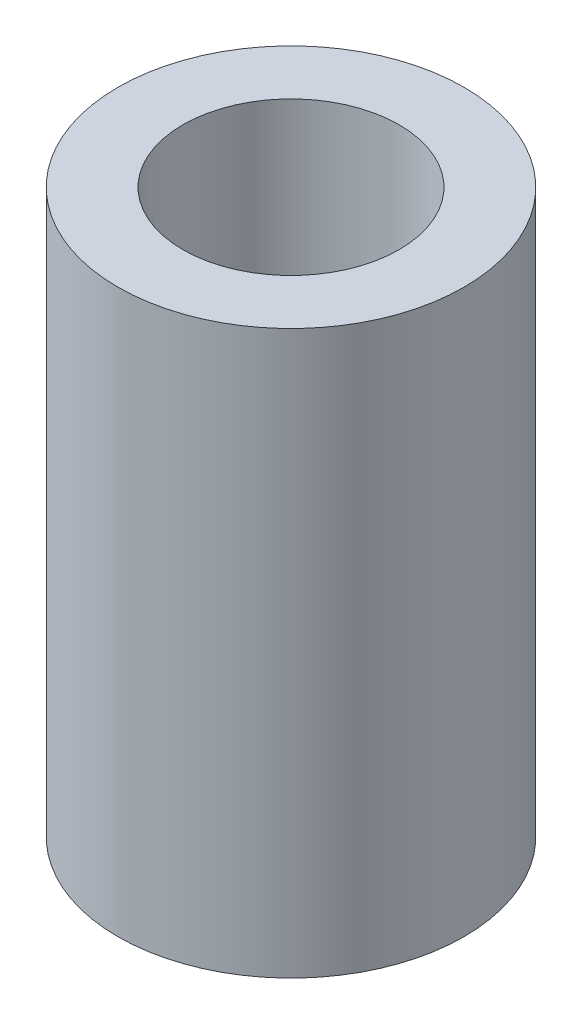
ISO-10303-21;
HEADER;
FILE_DESCRIPTION(('STEP AP214'),'2;1');
FILE_NAME('part.step','',(''),(''),'','','');
FILE_SCHEMA(('AUTOMOTIVE_DESIGN { 1 0 10303 214 1 1 1 1 }'));
ENDSEC;
DATA;
#1=APPLICATION_CONTEXT('core data for automotive mechanical design processes');
#2=APPLICATION_PROTOCOL_DEFINITION('international standard','automotive_design',2000,#1);
#3=PRODUCT_CONTEXT('',#1,'mechanical');
#4=PRODUCT('Part','Part','',(#3));
#5=PRODUCT_RELATED_PRODUCT_CATEGORY('part','',(#4));
#6=PRODUCT_DEFINITION_FORMATION('','',#4);
#7=PRODUCT_DEFINITION_CONTEXT('part definition',#1,'design');
#8=PRODUCT_DEFINITION('design','',#6,#7);
#9=PRODUCT_DEFINITION_SHAPE('','',#8);
#10=(LENGTH_UNIT() NAMED_UNIT(*) SI_UNIT(.MILLI.,.METRE.));
#11=(NAMED_UNIT(*) PLANE_ANGLE_UNIT() SI_UNIT($,.RADIAN.));
#12=(NAMED_UNIT(*) SI_UNIT($,.STERADIAN.) SOLID_ANGLE_UNIT());
#13=UNCERTAINTY_MEASURE_WITH_UNIT(LENGTH_MEASURE(1.E-05),#10,'distance_accuracy_value','');
#14=(GEOMETRIC_REPRESENTATION_CONTEXT(3) GLOBAL_UNCERTAINTY_ASSIGNED_CONTEXT((#13)) GLOBAL_UNIT_ASSIGNED_CONTEXT((#10,
#11,#12)) REPRESENTATION_CONTEXT('',''));
#15=CARTESIAN_POINT('',(0.,0.,0.));
#16=DIRECTION('',(0.,0.,1.));
#17=DIRECTION('',(1.,0.,0.));
#18=AXIS2_PLACEMENT_3D('',#15,#16,#17);
#19=CARTESIAN_POINT('',(0.,13.,0.));
#20=DIRECTION('',(0.,1.,0.));
#21=DIRECTION('',(0.,0.,1.));
#22=AXIS2_PLACEMENT_3D('',#19,#20,#21);
#23=PLANE('',#22);
#24=CARTESIAN_POINT('',(0.,13.,0.));
#25=DIRECTION('',(0.,1.,0.));
#26=DIRECTION('',(0.,0.,1.));
#27=AXIS2_PLACEMENT_3D('',#24,#25,#26);
#28=CIRCLE('',#27,4.);
#29=CARTESIAN_POINT('',(0.,13.,-4.));
#30=VERTEX_POINT('',#29);
#31=EDGE_CURVE('E10',#30,#30,#28,.T.);
#32=ORIENTED_EDGE('',*,*,#31,.T.);
#33=EDGE_LOOP('',(#32));
#34=FACE_BOUND('',#33,.T.);
#35=CARTESIAN_POINT('',(0.,13.,0.));
#36=DIRECTION('',(0.,1.,0.));
#37=DIRECTION('',(0.,0.,1.));
#38=AXIS2_PLACEMENT_3D('',#35,#36,#37);
#39=CIRCLE('',#38,2.5);
#40=CARTESIAN_POINT('',(0.,13.,-2.5));
#41=VERTEX_POINT('',#40);
#42=EDGE_CURVE('E44',#41,#41,#39,.T.);
#43=ORIENTED_EDGE('',*,*,#42,.F.);
#44=EDGE_LOOP('',(#43));
#45=FACE_BOUND('',#44,.T.);
#46=ADVANCED_FACE('F33',(#34,#45),#23,.T.);
#47=CARTESIAN_POINT('',(0.,0.,0.));
#48=DIRECTION('',(0.,1.,0.));
#49=DIRECTION('',(0.,0.,1.));
#50=AXIS2_PLACEMENT_3D('',#47,#48,#49);
#51=PLANE('',#50);
#52=CARTESIAN_POINT('',(0.,0.,0.));
#53=DIRECTION('',(0.,1.,0.));
#54=DIRECTION('',(0.,0.,1.));
#55=AXIS2_PLACEMENT_3D('',#52,#53,#54);
#56=CIRCLE('',#55,4.);
#57=CARTESIAN_POINT('',(0.,0.,-4.));
#58=VERTEX_POINT('',#57);
#59=EDGE_CURVE('E37',#58,#58,#56,.T.);
#60=ORIENTED_EDGE('',*,*,#59,.F.);
#61=EDGE_LOOP('',(#60));
#62=FACE_BOUND('',#61,.T.);
#63=CARTESIAN_POINT('',(0.,0.,0.));
#64=DIRECTION('',(0.,1.,0.));
#65=DIRECTION('',(0.,0.,1.));
#66=AXIS2_PLACEMENT_3D('',#63,#64,#65);
#67=CIRCLE('',#66,2.5);
#68=CARTESIAN_POINT('',(0.,0.,-2.5));
#69=VERTEX_POINT('',#68);
#70=EDGE_CURVE('E46',#69,#69,#67,.T.);
#71=ORIENTED_EDGE('',*,*,#70,.T.);
#72=EDGE_LOOP('',(#71));
#73=FACE_BOUND('',#72,.T.);
#74=ADVANCED_FACE('F56',(#62,#73),#51,.F.);
#75=CARTESIAN_POINT('',(0.,13.,0.));
#76=DIRECTION('',(0.,-1.,0.));
#77=DIRECTION('',(0.,0.,-1.));
#78=AXIS2_PLACEMENT_3D('',#75,#76,#77);
#79=CYLINDRICAL_SURFACE('',#78,4.);
#80=CARTESIAN_POINT('',(0.,13.,-4.));
#81=CARTESIAN_POINT('',(0.,12.8645833333333,-4.));
#82=CARTESIAN_POINT('',(0.,12.7291666666667,-4.));
#83=CARTESIAN_POINT('',(0.,12.4583333333333,-4.));
#84=CARTESIAN_POINT('',(0.,12.3229166666667,-4.));
#85=CARTESIAN_POINT('',(0.,12.0520833333333,-4.));
#86=CARTESIAN_POINT('',(0.,11.9166666666667,-4.));
#87=CARTESIAN_POINT('',(0.,11.6458333333333,-4.));
#88=CARTESIAN_POINT('',(0.,11.5104166666667,-4.));
#89=CARTESIAN_POINT('',(0.,11.2395833333333,-4.));
#90=CARTESIAN_POINT('',(0.,11.1041666666667,-4.));
#91=CARTESIAN_POINT('',(0.,10.8333333333333,-4.));
#92=CARTESIAN_POINT('',(0.,10.6979166666667,-4.));
#93=CARTESIAN_POINT('',(0.,10.4270833333333,-4.));
#94=CARTESIAN_POINT('',(0.,10.2916666666667,-4.));
#95=CARTESIAN_POINT('',(0.,10.0208333333333,-4.));
#96=CARTESIAN_POINT('',(0.,9.88541666666667,-4.));
#97=CARTESIAN_POINT('',(0.,9.61458333333333,-4.));
#98=CARTESIAN_POINT('',(0.,9.47916666666667,-4.));
#99=CARTESIAN_POINT('',(0.,9.20833333333333,-4.));
#100=CARTESIAN_POINT('',(0.,9.07291666666667,-4.));
#101=CARTESIAN_POINT('',(0.,8.80208333333333,-4.));
#102=CARTESIAN_POINT('',(0.,8.66666666666667,-4.));
#103=CARTESIAN_POINT('',(0.,8.39583333333333,-4.));
#104=CARTESIAN_POINT('',(0.,8.26041666666667,-4.));
#105=CARTESIAN_POINT('',(0.,7.98958333333333,-4.));
#106=CARTESIAN_POINT('',(0.,7.85416666666667,-4.));
#107=CARTESIAN_POINT('',(0.,7.58333333333333,-4.));
#108=CARTESIAN_POINT('',(0.,7.44791666666667,-4.));
#109=CARTESIAN_POINT('',(0.,7.17708333333333,-4.));
#110=CARTESIAN_POINT('',(0.,7.04166666666667,-4.));
#111=CARTESIAN_POINT('',(0.,6.77083333333333,-4.));
#112=CARTESIAN_POINT('',(0.,6.63541666666667,-4.));
#113=CARTESIAN_POINT('',(0.,6.36458333333333,-4.));
#114=CARTESIAN_POINT('',(0.,6.22916666666667,-4.));
#115=CARTESIAN_POINT('',(0.,5.95833333333333,-4.));
#116=CARTESIAN_POINT('',(0.,5.82291666666667,-4.));
#117=CARTESIAN_POINT('',(0.,5.55208333333333,-4.));
#118=CARTESIAN_POINT('',(0.,5.41666666666667,-4.));
#119=CARTESIAN_POINT('',(0.,5.14583333333333,-4.));
#120=CARTESIAN_POINT('',(0.,5.01041666666667,-4.));
#121=CARTESIAN_POINT('',(0.,4.73958333333333,-4.));
#122=CARTESIAN_POINT('',(0.,4.60416666666667,-4.));
#123=CARTESIAN_POINT('',(0.,4.33333333333333,-4.));
#124=CARTESIAN_POINT('',(0.,4.19791666666667,-4.));
#125=CARTESIAN_POINT('',(0.,3.92708333333333,-4.));
#126=CARTESIAN_POINT('',(0.,3.79166666666667,-4.));
#127=CARTESIAN_POINT('',(0.,3.52083333333333,-4.));
#128=CARTESIAN_POINT('',(0.,3.38541666666667,-4.));
#129=CARTESIAN_POINT('',(0.,3.11458333333333,-4.));
#130=CARTESIAN_POINT('',(0.,2.97916666666667,-4.));
#131=CARTESIAN_POINT('',(0.,2.70833333333333,-4.));
#132=CARTESIAN_POINT('',(0.,2.57291666666667,-4.));
#133=CARTESIAN_POINT('',(0.,2.30208333333333,-4.));
#134=CARTESIAN_POINT('',(0.,2.16666666666667,-4.));
#135=CARTESIAN_POINT('',(0.,1.89583333333333,-4.));
#136=CARTESIAN_POINT('',(0.,1.76041666666667,-4.));
#137=CARTESIAN_POINT('',(0.,1.48958333333333,-4.));
#138=CARTESIAN_POINT('',(0.,1.35416666666667,-4.));
#139=CARTESIAN_POINT('',(0.,1.08333333333333,-4.));
#140=CARTESIAN_POINT('',(0.,0.947916666666667,-4.));
#141=CARTESIAN_POINT('',(0.,0.677083333333334,-4.));
#142=CARTESIAN_POINT('',(0.,0.541666666666667,-4.));
#143=CARTESIAN_POINT('',(0.,0.270833333333334,-4.));
#144=CARTESIAN_POINT('',(0.,0.135416666666667,-4.));
#145=CARTESIAN_POINT('',(0.,0.,-4.));
#146=B_SPLINE_CURVE_WITH_KNOTS('',3,(#80,#81,#82,#83,#84,#85,#86,#87,#88,#89,#90,#91,#92,#93,
#94,#95,#96,#97,#98,#99,#100,#101,#102,#103,#104,#105,#106,#107,#108,#109,#110,#111,#112,#113,
#114,#115,#116,#117,#118,#119,#120,#121,#122,#123,#124,#125,#126,#127,#128,#129,#130,#131,#132,
#133,#134,#135,#136,#137,#138,#139,#140,#141,#142,#143,#144,#145),.UNSPECIFIED.,.F.,.F.,(4,2,2,
2,2,2,2,2,2,2,2,2,2,2,2,2,2,2,2,2,2,2,2,2,2,2,2,2,2,2,2,2,4),(0.,0.406249999999999,
0.812499999999999,1.21875,1.625,2.03125,2.4375,2.84375,3.25,3.65625,4.0625,4.46875,4.875,
5.28125,5.6875,6.09375,6.5,6.90625,7.3125,7.71875,8.125,8.53125,8.9375,9.34375,9.75,10.15625,
10.5625,10.96875,11.375,11.78125,12.1875,12.59375,13.),.UNSPECIFIED.);
#147=EDGE_CURVE('BSEAM35',#30,#58,#146,.T.);
#148=ORIENTED_EDGE('',*,*,#31,.F.);
#149=ORIENTED_EDGE('',*,*,#59,.T.);
#150=ORIENTED_EDGE('',*,*,#147,.T.);
#151=ORIENTED_EDGE('',*,*,#147,.F.);
#152=EDGE_LOOP('',(#148,#150,#149,#151));
#153=FACE_BOUND('',#152,.T.);
#154=ADVANCED_FACE('F35',(#153),#79,.T.);
#155=CARTESIAN_POINT('',(0.,13.,0.));
#156=DIRECTION('',(0.,-1.,0.));
#157=DIRECTION('',(0.,0.,-1.));
#158=AXIS2_PLACEMENT_3D('',#155,#156,#157);
#159=CYLINDRICAL_SURFACE('',#158,2.5);
#160=CARTESIAN_POINT('',(0.,13.,-2.5));
#161=CARTESIAN_POINT('',(0.,12.8645833333333,-2.5));
#162=CARTESIAN_POINT('',(0.,12.7291666666667,-2.5));
#163=CARTESIAN_POINT('',(0.,12.4583333333333,-2.5));
#164=CARTESIAN_POINT('',(0.,12.3229166666667,-2.5));
#165=CARTESIAN_POINT('',(0.,12.0520833333333,-2.5));
#166=CARTESIAN_POINT('',(0.,11.9166666666667,-2.5));
#167=CARTESIAN_POINT('',(0.,11.6458333333333,-2.5));
#168=CARTESIAN_POINT('',(0.,11.5104166666667,-2.5));
#169=CARTESIAN_POINT('',(0.,11.2395833333333,-2.5));
#170=CARTESIAN_POINT('',(0.,11.1041666666667,-2.5));
#171=CARTESIAN_POINT('',(0.,10.8333333333333,-2.5));
#172=CARTESIAN_POINT('',(0.,10.6979166666667,-2.5));
#173=CARTESIAN_POINT('',(0.,10.4270833333333,-2.5));
#174=CARTESIAN_POINT('',(0.,10.2916666666667,-2.5));
#175=CARTESIAN_POINT('',(0.,10.0208333333333,-2.5));
#176=CARTESIAN_POINT('',(0.,9.88541666666667,-2.5));
#177=CARTESIAN_POINT('',(0.,9.61458333333333,-2.5));
#178=CARTESIAN_POINT('',(0.,9.47916666666667,-2.5));
#179=CARTESIAN_POINT('',(0.,9.20833333333333,-2.5));
#180=CARTESIAN_POINT('',(0.,9.07291666666667,-2.5));
#181=CARTESIAN_POINT('',(0.,8.80208333333333,-2.5));
#182=CARTESIAN_POINT('',(0.,8.66666666666667,-2.5));
#183=CARTESIAN_POINT('',(0.,8.39583333333333,-2.5));
#184=CARTESIAN_POINT('',(0.,8.26041666666667,-2.5));
#185=CARTESIAN_POINT('',(0.,7.98958333333333,-2.5));
#186=CARTESIAN_POINT('',(0.,7.85416666666667,-2.5));
#187=CARTESIAN_POINT('',(0.,7.58333333333333,-2.5));
#188=CARTESIAN_POINT('',(0.,7.44791666666667,-2.5));
#189=CARTESIAN_POINT('',(0.,7.17708333333333,-2.5));
#190=CARTESIAN_POINT('',(0.,7.04166666666667,-2.5));
#191=CARTESIAN_POINT('',(0.,6.77083333333333,-2.5));
#192=CARTESIAN_POINT('',(0.,6.63541666666667,-2.5));
#193=CARTESIAN_POINT('',(0.,6.36458333333333,-2.5));
#194=CARTESIAN_POINT('',(0.,6.22916666666667,-2.5));
#195=CARTESIAN_POINT('',(0.,5.95833333333333,-2.5));
#196=CARTESIAN_POINT('',(0.,5.82291666666667,-2.5));
#197=CARTESIAN_POINT('',(0.,5.55208333333333,-2.5));
#198=CARTESIAN_POINT('',(0.,5.41666666666667,-2.5));
#199=CARTESIAN_POINT('',(0.,5.14583333333333,-2.5));
#200=CARTESIAN_POINT('',(0.,5.01041666666667,-2.5));
#201=CARTESIAN_POINT('',(0.,4.73958333333333,-2.5));
#202=CARTESIAN_POINT('',(0.,4.60416666666667,-2.5));
#203=CARTESIAN_POINT('',(0.,4.33333333333333,-2.5));
#204=CARTESIAN_POINT('',(0.,4.19791666666667,-2.5));
#205=CARTESIAN_POINT('',(0.,3.92708333333333,-2.5));
#206=CARTESIAN_POINT('',(0.,3.79166666666667,-2.5));
#207=CARTESIAN_POINT('',(0.,3.52083333333333,-2.5));
#208=CARTESIAN_POINT('',(0.,3.38541666666667,-2.5));
#209=CARTESIAN_POINT('',(0.,3.11458333333333,-2.5));
#210=CARTESIAN_POINT('',(0.,2.97916666666667,-2.5));
#211=CARTESIAN_POINT('',(0.,2.70833333333333,-2.5));
#212=CARTESIAN_POINT('',(0.,2.57291666666667,-2.5));
#213=CARTESIAN_POINT('',(0.,2.30208333333333,-2.5));
#214=CARTESIAN_POINT('',(0.,2.16666666666667,-2.5));
#215=CARTESIAN_POINT('',(0.,1.89583333333333,-2.5));
#216=CARTESIAN_POINT('',(0.,1.76041666666667,-2.5));
#217=CARTESIAN_POINT('',(0.,1.48958333333333,-2.5));
#218=CARTESIAN_POINT('',(0.,1.35416666666667,-2.5));
#219=CARTESIAN_POINT('',(0.,1.08333333333333,-2.5));
#220=CARTESIAN_POINT('',(0.,0.947916666666667,-2.5));
#221=CARTESIAN_POINT('',(0.,0.677083333333334,-2.5));
#222=CARTESIAN_POINT('',(0.,0.541666666666667,-2.5));
#223=CARTESIAN_POINT('',(0.,0.270833333333334,-2.5));
#224=CARTESIAN_POINT('',(0.,0.135416666666667,-2.5));
#225=CARTESIAN_POINT('',(0.,0.,-2.5));
#226=B_SPLINE_CURVE_WITH_KNOTS('',3,(#160,#161,#162,#163,#164,#165,#166,#167,#168,#169,#170,
#171,#172,#173,#174,#175,#176,#177,#178,#179,#180,#181,#182,#183,#184,#185,#186,#187,#188,#189,
#190,#191,#192,#193,#194,#195,#196,#197,#198,#199,#200,#201,#202,#203,#204,#205,#206,#207,#208,
#209,#210,#211,#212,#213,#214,#215,#216,#217,#218,#219,#220,#221,#222,#223,#224,#225),
.UNSPECIFIED.,.F.,.F.,(4,2,2,2,2,2,2,2,2,2,2,2,2,2,2,2,2,2,2,2,2,2,2,2,2,2,2,2,2,2,2,2,4),(0.,
0.406249999999999,0.812499999999999,1.21875,1.625,2.03125,2.4375,2.84375,3.25,3.65625,4.0625,
4.46875,4.875,5.28125,5.6875,6.09375,6.5,6.90625,7.3125,7.71875,8.125,8.53125,8.9375,9.34375,
9.75,10.15625,10.5625,10.96875,11.375,11.78125,12.1875,12.59375,13.),.UNSPECIFIED.);
#227=EDGE_CURVE('BSEAM52',#41,#69,#226,.T.);
#228=ORIENTED_EDGE('',*,*,#42,.T.);
#229=ORIENTED_EDGE('',*,*,#70,.F.);
#230=ORIENTED_EDGE('',*,*,#227,.T.);
#231=ORIENTED_EDGE('',*,*,#227,.F.);
#232=EDGE_LOOP('',(#228,#230,#229,#231));
#233=FACE_BOUND('',#232,.T.);
#234=ADVANCED_FACE('F52',(#233),#159,.F.);
#235=CLOSED_SHELL('',(#46,#74,#154,#234));
#236=MANIFOLD_SOLID_BREP('B2',#235);
#237=ADVANCED_BREP_SHAPE_REPRESENTATION('',(#18,#236),#14);
#238=SHAPE_DEFINITION_REPRESENTATION(#9,#237);
ENDSEC;
END-ISO-10303-21;
